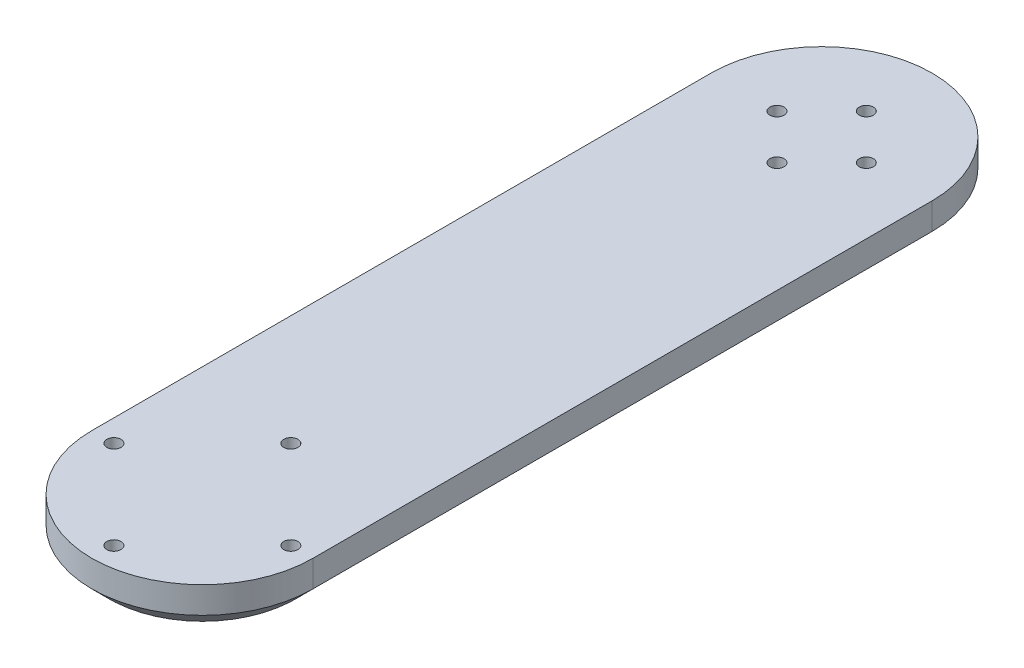
ISO-10303-21;
HEADER;
FILE_DESCRIPTION(('STEP AP214'),'2;1');
FILE_NAME('part.step','',(''),(''),'','','');
FILE_SCHEMA(('AUTOMOTIVE_DESIGN { 1 0 10303 214 1 1 1 1 }'));
ENDSEC;
DATA;
#1=APPLICATION_CONTEXT('core data for automotive mechanical design processes');
#2=APPLICATION_PROTOCOL_DEFINITION('international standard','automotive_design',2000,#1);
#3=PRODUCT_CONTEXT('',#1,'mechanical');
#4=PRODUCT('Part','Part','',(#3));
#5=PRODUCT_RELATED_PRODUCT_CATEGORY('part','',(#4));
#6=PRODUCT_DEFINITION_FORMATION('','',#4);
#7=PRODUCT_DEFINITION_CONTEXT('part definition',#1,'design');
#8=PRODUCT_DEFINITION('design','',#6,#7);
#9=PRODUCT_DEFINITION_SHAPE('','',#8);
#10=(LENGTH_UNIT() NAMED_UNIT(*) SI_UNIT(.MILLI.,.METRE.));
#11=(NAMED_UNIT(*) PLANE_ANGLE_UNIT() SI_UNIT($,.RADIAN.));
#12=(NAMED_UNIT(*) SI_UNIT($,.STERADIAN.) SOLID_ANGLE_UNIT());
#13=UNCERTAINTY_MEASURE_WITH_UNIT(LENGTH_MEASURE(1.E-05),#10,'distance_accuracy_value','');
#14=(GEOMETRIC_REPRESENTATION_CONTEXT(3) GLOBAL_UNCERTAINTY_ASSIGNED_CONTEXT((#13)) GLOBAL_UNIT_ASSIGNED_CONTEXT((#10,
#11,#12)) REPRESENTATION_CONTEXT('',''));
#15=CARTESIAN_POINT('',(0.,0.,0.));
#16=DIRECTION('',(0.,0.,1.));
#17=DIRECTION('',(1.,0.,0.));
#18=AXIS2_PLACEMENT_3D('',#15,#16,#17);
#19=CARTESIAN_POINT('',(0.,10.,0.));
#20=DIRECTION('',(0.,-1.,0.));
#21=DIRECTION('',(0.,0.,-1.));
#22=AXIS2_PLACEMENT_3D('',#19,#20,#21);
#23=CYLINDRICAL_SURFACE('',#22,25.);
#24=DIRECTION('',(0.,-1.,0.));
#25=VECTOR('',#24,1.);
#26=CARTESIAN_POINT('',(25.,10.,0.));
#27=LINE('',#26,#25);
#28=CARTESIAN_POINT('',(25.,10.,0.));
#29=VERTEX_POINT('',#28);
#30=CARTESIAN_POINT('',(25.,4.00000000000001,0.));
#31=VERTEX_POINT('',#30);
#32=EDGE_CURVE('E278',#29,#31,#27,.T.);
#33=ORIENTED_EDGE('',*,*,#32,.T.);
#34=CARTESIAN_POINT('',(0.,4.00000000000001,0.));
#35=DIRECTION('',(0.,1.,0.));
#36=DIRECTION('',(0.,0.,1.));
#37=AXIS2_PLACEMENT_3D('',#34,#35,#36);
#38=CIRCLE('',#37,25.);
#39=CARTESIAN_POINT('',(-25.,4.00000000000001,0.));
#40=VERTEX_POINT('',#39);
#41=EDGE_CURVE('E11',#31,#40,#38,.T.);
#42=ORIENTED_EDGE('',*,*,#41,.T.);
#43=DIRECTION('',(0.,-1.,0.));
#44=VECTOR('',#43,1.);
#45=CARTESIAN_POINT('',(-25.,10.,0.));
#46=LINE('',#45,#44);
#47=CARTESIAN_POINT('',(-25.,10.,0.));
#48=VERTEX_POINT('',#47);
#49=EDGE_CURVE('E125',#48,#40,#46,.T.);
#50=ORIENTED_EDGE('',*,*,#49,.F.);
#51=CARTESIAN_POINT('',(0.,10.,0.));
#52=DIRECTION('',(0.,1.,0.));
#53=DIRECTION('',(0.,0.,1.));
#54=AXIS2_PLACEMENT_3D('',#51,#52,#53);
#55=CIRCLE('',#54,25.);
#56=EDGE_CURVE('E133',#29,#48,#55,.T.);
#57=ORIENTED_EDGE('',*,*,#56,.F.);
#58=EDGE_LOOP('',(#33,#42,#50,#57));
#59=FACE_BOUND('',#58,.T.);
#60=ADVANCED_FACE('F47',(#59),#23,.T.);
#61=CARTESIAN_POINT('',(-25.,10.,0.));
#62=DIRECTION('',(1.,0.,0.));
#63=DIRECTION('',(0.,0.,-1.));
#64=AXIS2_PLACEMENT_3D('',#61,#62,#63);
#65=PLANE('',#64);
#66=ORIENTED_EDGE('',*,*,#49,.T.);
#67=DIRECTION('',(0.,0.,1.));
#68=VECTOR('',#67,1.);
#69=CARTESIAN_POINT('',(-25.,4.00000000000001,0.));
#70=LINE('',#69,#68);
#71=CARTESIAN_POINT('',(-25.,4.00000000000001,140.));
#72=VERTEX_POINT('',#71);
#73=EDGE_CURVE('E58',#40,#72,#70,.T.);
#74=ORIENTED_EDGE('',*,*,#73,.T.);
#75=DIRECTION('',(0.,-1.,0.));
#76=VECTOR('',#75,1.);
#77=CARTESIAN_POINT('',(-25.,10.,140.));
#78=LINE('',#77,#76);
#79=CARTESIAN_POINT('',(-25.,10.,140.));
#80=VERTEX_POINT('',#79);
#81=EDGE_CURVE('E128',#80,#72,#78,.T.);
#82=ORIENTED_EDGE('',*,*,#81,.F.);
#83=DIRECTION('',(0.,0.,1.));
#84=VECTOR('',#83,1.);
#85=CARTESIAN_POINT('',(-25.,10.,0.));
#86=LINE('',#85,#84);
#87=EDGE_CURVE('E122',#48,#80,#86,.T.);
#88=ORIENTED_EDGE('',*,*,#87,.F.);
#89=EDGE_LOOP('',(#66,#74,#82,#88));
#90=FACE_BOUND('',#89,.T.);
#91=ADVANCED_FACE('F124',(#90),#65,.F.);
#92=CARTESIAN_POINT('',(0.,10.,140.));
#93=DIRECTION('',(0.,-1.,0.));
#94=DIRECTION('',(0.,0.,-1.));
#95=AXIS2_PLACEMENT_3D('',#92,#93,#94);
#96=CYLINDRICAL_SURFACE('',#95,25.);
#97=ORIENTED_EDGE('',*,*,#81,.T.);
#98=CARTESIAN_POINT('',(0.,4.00000000000001,140.));
#99=DIRECTION('',(0.,1.,0.));
#100=DIRECTION('',(0.,0.,1.));
#101=AXIS2_PLACEMENT_3D('',#98,#99,#100);
#102=CIRCLE('',#101,25.);
#103=CARTESIAN_POINT('',(25.,4.00000000000001,140.));
#104=VERTEX_POINT('',#103);
#105=EDGE_CURVE('E143',#72,#104,#102,.T.);
#106=ORIENTED_EDGE('',*,*,#105,.T.);
#107=DIRECTION('',(0.,-1.,0.));
#108=VECTOR('',#107,1.);
#109=CARTESIAN_POINT('',(25.,10.,140.));
#110=LINE('',#109,#108);
#111=CARTESIAN_POINT('',(25.,10.,140.));
#112=VERTEX_POINT('',#111);
#113=EDGE_CURVE('E150',#112,#104,#110,.T.);
#114=ORIENTED_EDGE('',*,*,#113,.F.);
#115=CARTESIAN_POINT('',(0.,10.,140.));
#116=DIRECTION('',(0.,1.,0.));
#117=DIRECTION('',(0.,0.,1.));
#118=AXIS2_PLACEMENT_3D('',#115,#116,#117);
#119=CIRCLE('',#118,25.);
#120=EDGE_CURVE('E132',#80,#112,#119,.T.);
#121=ORIENTED_EDGE('',*,*,#120,.F.);
#122=EDGE_LOOP('',(#97,#106,#114,#121));
#123=FACE_BOUND('',#122,.T.);
#124=ADVANCED_FACE('F284',(#123),#96,.T.);
#125=CARTESIAN_POINT('',(25.,10.,0.));
#126=DIRECTION('',(-1.,0.,0.));
#127=DIRECTION('',(0.,0.,1.));
#128=AXIS2_PLACEMENT_3D('',#125,#126,#127);
#129=PLANE('',#128);
#130=ORIENTED_EDGE('',*,*,#113,.T.);
#131=DIRECTION('',(0.,0.,-1.));
#132=VECTOR('',#131,1.);
#133=CARTESIAN_POINT('',(25.,4.00000000000001,0.));
#134=LINE('',#133,#132);
#135=EDGE_CURVE('E72',#104,#31,#134,.T.);
#136=ORIENTED_EDGE('',*,*,#135,.T.);
#137=ORIENTED_EDGE('',*,*,#32,.F.);
#138=DIRECTION('',(0.,0.,-1.));
#139=VECTOR('',#138,1.);
#140=CARTESIAN_POINT('',(25.,10.,0.));
#141=LINE('',#140,#139);
#142=EDGE_CURVE('E138',#112,#29,#141,.T.);
#143=ORIENTED_EDGE('',*,*,#142,.F.);
#144=EDGE_LOOP('',(#130,#136,#137,#143));
#145=FACE_BOUND('',#144,.T.);
#146=ADVANCED_FACE('F282',(#145),#129,.F.);
#147=CARTESIAN_POINT('',(0.,10.,0.));
#148=DIRECTION('',(0.,1.,0.));
#149=DIRECTION('',(0.,0.,1.));
#150=AXIS2_PLACEMENT_3D('',#147,#148,#149);
#151=PLANE('',#150);
#152=CARTESIAN_POINT('',(0.,10.,120.));
#153=DIRECTION('',(0.,-1.,0.));
#154=DIRECTION('',(0.,0.,-1.));
#155=AXIS2_PLACEMENT_3D('',#152,#153,#154);
#156=CIRCLE('',#155,1.6);
#157=CARTESIAN_POINT('',(0.,10.,118.4));
#158=VERTEX_POINT('',#157);
#159=EDGE_CURVE('E272',#158,#158,#156,.T.);
#160=ORIENTED_EDGE('',*,*,#159,.T.);
#161=EDGE_LOOP('',(#160));
#162=FACE_BOUND('',#161,.T.);
#163=CARTESIAN_POINT('',(20.,10.,140.));
#164=DIRECTION('',(0.,-1.,0.));
#165=DIRECTION('',(0.,0.,-1.));
#166=AXIS2_PLACEMENT_3D('',#163,#164,#165);
#167=CIRCLE('',#166,1.59999999999999);
#168=CARTESIAN_POINT('',(20.,10.,138.4));
#169=VERTEX_POINT('',#168);
#170=EDGE_CURVE('E383',#169,#169,#167,.T.);
#171=ORIENTED_EDGE('',*,*,#170,.T.);
#172=EDGE_LOOP('',(#171));
#173=FACE_BOUND('',#172,.T.);
#174=CARTESIAN_POINT('',(0.,10.,160.));
#175=DIRECTION('',(0.,-1.,0.));
#176=DIRECTION('',(0.,0.,-1.));
#177=AXIS2_PLACEMENT_3D('',#174,#175,#176);
#178=CIRCLE('',#177,1.59999999999999);
#179=CARTESIAN_POINT('',(0.,10.,158.4));
#180=VERTEX_POINT('',#179);
#181=EDGE_CURVE('E238',#180,#180,#178,.T.);
#182=ORIENTED_EDGE('',*,*,#181,.T.);
#183=EDGE_LOOP('',(#182));
#184=FACE_BOUND('',#183,.T.);
#185=CARTESIAN_POINT('',(-20.,10.,140.));
#186=DIRECTION('',(0.,-1.,0.));
#187=DIRECTION('',(0.,0.,-1.));
#188=AXIS2_PLACEMENT_3D('',#185,#186,#187);
#189=CIRCLE('',#188,1.59999999999999);
#190=CARTESIAN_POINT('',(-20.,10.,138.4));
#191=VERTEX_POINT('',#190);
#192=EDGE_CURVE('E226',#191,#191,#189,.T.);
#193=ORIENTED_EDGE('',*,*,#192,.T.);
#194=EDGE_LOOP('',(#193));
#195=FACE_BOUND('',#194,.T.);
#196=CARTESIAN_POINT('',(10.0985931710275,10.,0.));
#197=DIRECTION('',(0.,-1.,0.));
#198=DIRECTION('',(0.,0.,-1.));
#199=AXIS2_PLACEMENT_3D('',#196,#197,#198);
#200=CIRCLE('',#199,1.60000000000001);
#201=CARTESIAN_POINT('',(10.0985931710275,10.,-1.60000000000007));
#202=VERTEX_POINT('',#201);
#203=EDGE_CURVE('E140',#202,#202,#200,.T.);
#204=ORIENTED_EDGE('',*,*,#203,.T.);
#205=EDGE_LOOP('',(#204));
#206=FACE_BOUND('',#205,.T.);
#207=CARTESIAN_POINT('',(0.,10.,10.0985931710274));
#208=DIRECTION('',(0.,-1.,0.));
#209=DIRECTION('',(0.,0.,-1.));
#210=AXIS2_PLACEMENT_3D('',#207,#208,#209);
#211=CIRCLE('',#210,1.60000000000001);
#212=CARTESIAN_POINT('',(0.,10.,8.49859317102738));
#213=VERTEX_POINT('',#212);
#214=EDGE_CURVE('E253',#213,#213,#211,.T.);
#215=ORIENTED_EDGE('',*,*,#214,.T.);
#216=EDGE_LOOP('',(#215));
#217=FACE_BOUND('',#216,.T.);
#218=CARTESIAN_POINT('',(0.,10.,-10.0985931710275));
#219=DIRECTION('',(0.,-1.,0.));
#220=DIRECTION('',(0.,0.,-1.));
#221=AXIS2_PLACEMENT_3D('',#218,#219,#220);
#222=CIRCLE('',#221,1.60000000000001);
#223=CARTESIAN_POINT('',(0.,10.,-11.6985931710275));
#224=VERTEX_POINT('',#223);
#225=EDGE_CURVE('E261',#224,#224,#222,.T.);
#226=ORIENTED_EDGE('',*,*,#225,.T.);
#227=EDGE_LOOP('',(#226));
#228=FACE_BOUND('',#227,.T.);
#229=CARTESIAN_POINT('',(-10.0985931710274,10.,0.));
#230=DIRECTION('',(0.,-1.,0.));
#231=DIRECTION('',(0.,0.,-1.));
#232=AXIS2_PLACEMENT_3D('',#229,#230,#231);
#233=CIRCLE('',#232,1.60000000000001);
#234=CARTESIAN_POINT('',(-10.0985931710274,10.,-1.60000000000007));
#235=VERTEX_POINT('',#234);
#236=EDGE_CURVE('E269',#235,#235,#233,.T.);
#237=ORIENTED_EDGE('',*,*,#236,.T.);
#238=EDGE_LOOP('',(#237));
#239=FACE_BOUND('',#238,.T.);
#240=ORIENTED_EDGE('',*,*,#56,.T.);
#241=ORIENTED_EDGE('',*,*,#87,.T.);
#242=ORIENTED_EDGE('',*,*,#120,.T.);
#243=ORIENTED_EDGE('',*,*,#142,.T.);
#244=EDGE_LOOP('',(#240,#241,#242,#243));
#245=FACE_BOUND('',#244,.T.);
#246=ADVANCED_FACE('F136',(#162,#173,#184,#195,#206,#217,#228,#239,#245),#151,.T.);
#247=CARTESIAN_POINT('',(0.,0.,0.));
#248=DIRECTION('',(0.,1.,0.));
#249=DIRECTION('',(0.,0.,1.));
#250=AXIS2_PLACEMENT_3D('',#247,#248,#249);
#251=PLANE('',#250);
#252=CARTESIAN_POINT('',(0.,0.,120.));
#253=DIRECTION('',(0.,-1.,0.));
#254=DIRECTION('',(0.,0.,-1.));
#255=AXIS2_PLACEMENT_3D('',#252,#253,#254);
#256=CIRCLE('',#255,1.6);
#257=CARTESIAN_POINT('',(0.,0.,118.4));
#258=VERTEX_POINT('',#257);
#259=EDGE_CURVE('E382',#258,#258,#256,.T.);
#260=ORIENTED_EDGE('',*,*,#259,.F.);
#261=EDGE_LOOP('',(#260));
#262=FACE_BOUND('',#261,.T.);
#263=CARTESIAN_POINT('',(20.,0.,140.));
#264=DIRECTION('',(0.,-1.,0.));
#265=DIRECTION('',(0.,0.,-1.));
#266=AXIS2_PLACEMENT_3D('',#263,#264,#265);
#267=CIRCLE('',#266,1.59999999999999);
#268=CARTESIAN_POINT('',(20.961,0.,141.27924938929));
#269=VERTEX_POINT('',#268);
#270=CARTESIAN_POINT('',(21.,0.,138.75100040032));
#271=VERTEX_POINT('',#270);
#272=EDGE_CURVE('E380',#269,#271,#267,.T.);
#273=ORIENTED_EDGE('',*,*,#272,.F.);
#274=CARTESIAN_POINT('',(0.,0.,140.));
#275=DIRECTION('',(0.,1.,0.));
#276=DIRECTION('',(0.,0.,1.));
#277=AXIS2_PLACEMENT_3D('',#274,#275,#276);
#278=CIRCLE('',#277,21.);
#279=CARTESIAN_POINT('',(1.2792493892904,0.,160.961));
#280=VERTEX_POINT('',#279);
#281=EDGE_CURVE('E197',#269,#280,#278,.F.);
#282=ORIENTED_EDGE('',*,*,#281,.T.);
#283=CARTESIAN_POINT('',(0.,0.,160.));
#284=DIRECTION('',(0.,-1.,0.));
#285=DIRECTION('',(0.,0.,-1.));
#286=AXIS2_PLACEMENT_3D('',#283,#284,#285);
#287=CIRCLE('',#286,1.59999999999999);
#288=CARTESIAN_POINT('',(-1.27924938929037,0.,160.961));
#289=VERTEX_POINT('',#288);
#290=EDGE_CURVE('E390',#289,#280,#287,.T.);
#291=ORIENTED_EDGE('',*,*,#290,.F.);
#292=CARTESIAN_POINT('',(0.,0.,140.));
#293=DIRECTION('',(0.,1.,0.));
#294=DIRECTION('',(0.,0.,1.));
#295=AXIS2_PLACEMENT_3D('',#292,#293,#294);
#296=CIRCLE('',#295,21.);
#297=CARTESIAN_POINT('',(-20.961,0.,141.27924938929));
#298=VERTEX_POINT('',#297);
#299=EDGE_CURVE('E364',#289,#298,#296,.F.);
#300=ORIENTED_EDGE('',*,*,#299,.T.);
#301=CARTESIAN_POINT('',(-20.,0.,140.));
#302=DIRECTION('',(0.,-1.,0.));
#303=DIRECTION('',(0.,0.,-1.));
#304=AXIS2_PLACEMENT_3D('',#301,#302,#303);
#305=CIRCLE('',#304,1.59999999999999);
#306=CARTESIAN_POINT('',(-21.,0.,138.75100040032));
#307=VERTEX_POINT('',#306);
#308=EDGE_CURVE('E232',#307,#298,#305,.T.);
#309=ORIENTED_EDGE('',*,*,#308,.F.);
#310=DIRECTION('',(0.,0.,-1.));
#311=VECTOR('',#310,1.);
#312=CARTESIAN_POINT('',(-21.,0.,0.));
#313=LINE('',#312,#311);
#314=CARTESIAN_POINT('',(-21.,0.,0.));
#315=VERTEX_POINT('',#314);
#316=EDGE_CURVE('E371',#307,#315,#313,.T.);
#317=ORIENTED_EDGE('',*,*,#316,.T.);
#318=CARTESIAN_POINT('',(0.,0.,0.));
#319=DIRECTION('',(0.,1.,0.));
#320=DIRECTION('',(0.,0.,1.));
#321=AXIS2_PLACEMENT_3D('',#318,#319,#320);
#322=CIRCLE('',#321,21.);
#323=CARTESIAN_POINT('',(21.,0.,0.));
#324=VERTEX_POINT('',#323);
#325=EDGE_CURVE('E165',#315,#324,#322,.F.);
#326=ORIENTED_EDGE('',*,*,#325,.T.);
#327=DIRECTION('',(0.,0.,1.));
#328=VECTOR('',#327,1.);
#329=CARTESIAN_POINT('',(21.,0.,0.));
#330=LINE('',#329,#328);
#331=EDGE_CURVE('E368',#324,#271,#330,.T.);
#332=ORIENTED_EDGE('',*,*,#331,.T.);
#333=EDGE_LOOP('',(#273,#282,#291,#300,#309,#317,#326,#332));
#334=FACE_BOUND('',#333,.T.);
#335=CARTESIAN_POINT('',(10.0985931710275,0.,0.));
#336=DIRECTION('',(0.,-1.,0.));
#337=DIRECTION('',(0.,0.,-1.));
#338=AXIS2_PLACEMENT_3D('',#335,#336,#337);
#339=CIRCLE('',#338,1.60000000000001);
#340=CARTESIAN_POINT('',(10.0985931710275,0.,-1.60000000000007));
#341=VERTEX_POINT('',#340);
#342=EDGE_CURVE('E245',#341,#341,#339,.T.);
#343=ORIENTED_EDGE('',*,*,#342,.F.);
#344=EDGE_LOOP('',(#343));
#345=FACE_BOUND('',#344,.T.);
#346=CARTESIAN_POINT('',(0.,0.,10.0985931710274));
#347=DIRECTION('',(0.,-1.,0.));
#348=DIRECTION('',(0.,0.,-1.));
#349=AXIS2_PLACEMENT_3D('',#346,#347,#348);
#350=CIRCLE('',#349,1.60000000000001);
#351=CARTESIAN_POINT('',(0.,0.,8.49859317102738));
#352=VERTEX_POINT('',#351);
#353=EDGE_CURVE('E249',#352,#352,#350,.T.);
#354=ORIENTED_EDGE('',*,*,#353,.F.);
#355=EDGE_LOOP('',(#354));
#356=FACE_BOUND('',#355,.T.);
#357=CARTESIAN_POINT('',(0.,0.,-10.0985931710275));
#358=DIRECTION('',(0.,-1.,0.));
#359=DIRECTION('',(0.,0.,-1.));
#360=AXIS2_PLACEMENT_3D('',#357,#358,#359);
#361=CIRCLE('',#360,1.60000000000001);
#362=CARTESIAN_POINT('',(0.,0.,-11.6985931710275));
#363=VERTEX_POINT('',#362);
#364=EDGE_CURVE('E257',#363,#363,#361,.T.);
#365=ORIENTED_EDGE('',*,*,#364,.F.);
#366=EDGE_LOOP('',(#365));
#367=FACE_BOUND('',#366,.T.);
#368=CARTESIAN_POINT('',(-10.0985931710274,0.,0.));
#369=DIRECTION('',(0.,-1.,0.));
#370=DIRECTION('',(0.,0.,-1.));
#371=AXIS2_PLACEMENT_3D('',#368,#369,#370);
#372=CIRCLE('',#371,1.60000000000001);
#373=CARTESIAN_POINT('',(-10.0985931710274,0.,-1.60000000000007));
#374=VERTEX_POINT('',#373);
#375=EDGE_CURVE('E265',#374,#374,#372,.T.);
#376=ORIENTED_EDGE('',*,*,#375,.F.);
#377=EDGE_LOOP('',(#376));
#378=FACE_BOUND('',#377,.T.);
#379=ADVANCED_FACE('F312',(#262,#334,#345,#356,#367,#378),#251,.F.);
#380=CARTESIAN_POINT('',(-10.0985931710274,10.,0.));
#381=DIRECTION('',(0.,-1.,0.));
#382=DIRECTION('',(0.,0.,-1.));
#383=AXIS2_PLACEMENT_3D('',#380,#381,#382);
#384=CYLINDRICAL_SURFACE('',#383,1.60000000000001);
#385=ORIENTED_EDGE('',*,*,#236,.F.);
#386=EDGE_LOOP('',(#385));
#387=FACE_BOUND('',#386,.T.);
#388=ORIENTED_EDGE('',*,*,#375,.T.);
#389=EDGE_LOOP('',(#388));
#390=FACE_BOUND('',#389,.T.);
#391=ADVANCED_FACE('F315',(#387,#390),#384,.F.);
#392=CARTESIAN_POINT('',(0.,10.,-10.0985931710275));
#393=DIRECTION('',(0.,-1.,0.));
#394=DIRECTION('',(0.,0.,-1.));
#395=AXIS2_PLACEMENT_3D('',#392,#393,#394);
#396=CYLINDRICAL_SURFACE('',#395,1.60000000000001);
#397=ORIENTED_EDGE('',*,*,#225,.F.);
#398=EDGE_LOOP('',(#397));
#399=FACE_BOUND('',#398,.T.);
#400=ORIENTED_EDGE('',*,*,#364,.T.);
#401=EDGE_LOOP('',(#400));
#402=FACE_BOUND('',#401,.T.);
#403=ADVANCED_FACE('F322',(#399,#402),#396,.F.);
#404=CARTESIAN_POINT('',(0.,10.,10.0985931710274));
#405=DIRECTION('',(0.,-1.,0.));
#406=DIRECTION('',(0.,0.,-1.));
#407=AXIS2_PLACEMENT_3D('',#404,#405,#406);
#408=CYLINDRICAL_SURFACE('',#407,1.60000000000001);
#409=ORIENTED_EDGE('',*,*,#214,.F.);
#410=EDGE_LOOP('',(#409));
#411=FACE_BOUND('',#410,.T.);
#412=ORIENTED_EDGE('',*,*,#353,.T.);
#413=EDGE_LOOP('',(#412));
#414=FACE_BOUND('',#413,.T.);
#415=ADVANCED_FACE('F326',(#411,#414),#408,.F.);
#416=CARTESIAN_POINT('',(10.0985931710275,10.,0.));
#417=DIRECTION('',(0.,-1.,0.));
#418=DIRECTION('',(0.,0.,-1.));
#419=AXIS2_PLACEMENT_3D('',#416,#417,#418);
#420=CYLINDRICAL_SURFACE('',#419,1.60000000000001);
#421=ORIENTED_EDGE('',*,*,#203,.F.);
#422=EDGE_LOOP('',(#421));
#423=FACE_BOUND('',#422,.T.);
#424=ORIENTED_EDGE('',*,*,#342,.T.);
#425=EDGE_LOOP('',(#424));
#426=FACE_BOUND('',#425,.T.);
#427=ADVANCED_FACE('F329',(#423,#426),#420,.F.);
#428=CARTESIAN_POINT('',(-20.,10.,140.));
#429=DIRECTION('',(0.,-1.,0.));
#430=DIRECTION('',(0.,0.,-1.));
#431=AXIS2_PLACEMENT_3D('',#428,#429,#430);
#432=CYLINDRICAL_SURFACE('',#431,1.59999999999999);
#433=ORIENTED_EDGE('',*,*,#192,.F.);
#434=EDGE_LOOP('',(#433));
#435=FACE_BOUND('',#434,.T.);
#436=ORIENTED_EDGE('',*,*,#308,.T.);
#437=CARTESIAN_POINT('',(-20.961,0.,141.27924938929));
#438=CARTESIAN_POINT('',(-21.0266927508743,0.0625761671923724,141.22990480349));
#439=CARTESIAN_POINT('',(-21.0903995474147,0.122957620692161,141.174107593131));
#440=CARTESIAN_POINT('',(-21.2114098926424,0.237221240759362,141.048880073953));
#441=CARTESIAN_POINT('',(-21.2686476069787,0.29103696397094,140.979326519933));
#442=CARTESIAN_POINT('',(-21.3608973825036,0.377496044244204,140.84439307812));
#443=CARTESIAN_POINT('',(-21.3979896323169,0.412158840896568,140.781758368361));
#444=CARTESIAN_POINT('',(-21.4642366224618,0.473947305640577,140.649206696684));
#445=CARTESIAN_POINT('',(-21.4934178503671,0.501098131650166,140.579315147105));
#446=CARTESIAN_POINT('',(-21.5386456584481,0.543124357247478,140.443771790856));
#447=CARTESIAN_POINT('',(-21.5559653001771,0.559191962855602,140.378915577703));
#448=CARTESIAN_POINT('',(-21.5823891205658,0.583691038078066,140.246169699359));
#449=CARTESIAN_POINT('',(-21.5915067345281,0.592134995664881,140.17828518686));
#450=CARTESIAN_POINT('',(-21.5974791481647,0.597665750832051,140.09165227218));
#451=CARTESIAN_POINT('',(-21.598424366787,0.598541028635356,140.073334598142));
#452=CARTESIAN_POINT('',(-21.5996839388714,0.599707367007014,140.03668026352));
#453=CARTESIAN_POINT('',(-21.5999990221802,0.599999103455214,140.018343649542));
#454=CARTESIAN_POINT('',(-21.6,0.599999999999969,140.));
#455=B_SPLINE_CURVE_WITH_KNOTS('',3,(#437,#438,#439,#440,#441,#442,#443,#444,#445,#446,#447,
#448,#449,#450,#451,#452,#453,#454),.UNSPECIFIED.,.F.,.F.,(4,2,2,2,2,2,2,2,4),(0.,
0.310380522223147,0.623679221150237,0.86463004182366,1.10476386101359,1.31097859885191,
1.51685492902013,1.57193065486272,1.62694255287585),.UNSPECIFIED.);
#456=CARTESIAN_POINT('',(-21.6,0.599999999999964,140.));
#457=VERTEX_POINT('',#456);
#458=EDGE_CURVE('E201',#298,#457,#455,.T.);
#459=ORIENTED_EDGE('',*,*,#458,.T.);
#460=CARTESIAN_POINT('',(-20.,-1.00000000000003,140.));
#461=DIRECTION('',(0.707106781186549,0.707106781186547,0.));
#462=DIRECTION('',(0.707106781186547,-0.707106781186549,0.));
#463=AXIS2_PLACEMENT_3D('',#460,#461,#462);
#464=ELLIPSE('',#463,2.26274169979694,1.59999999999999);
#465=EDGE_CURVE('E196',#457,#307,#464,.F.);
#466=ORIENTED_EDGE('',*,*,#465,.T.);
#467=EDGE_LOOP('',(#436,#459,#466));
#468=FACE_BOUND('',#467,.T.);
#469=ADVANCED_FACE('F183',(#435,#468),#432,.F.);
#470=CARTESIAN_POINT('',(0.,10.,160.));
#471=DIRECTION('',(0.,-1.,0.));
#472=DIRECTION('',(0.,0.,-1.));
#473=AXIS2_PLACEMENT_3D('',#470,#471,#472);
#474=CYLINDRICAL_SURFACE('',#473,1.59999999999999);
#475=ORIENTED_EDGE('',*,*,#181,.F.);
#476=EDGE_LOOP('',(#475));
#477=FACE_BOUND('',#476,.T.);
#478=ORIENTED_EDGE('',*,*,#290,.T.);
#479=CARTESIAN_POINT('',(1.2792493892904,0.,160.961));
#480=CARTESIAN_POINT('',(1.22989478676789,0.0625857759260987,161.026702835617));
#481=CARTESIAN_POINT('',(1.17408967534836,0.12297570451546,161.090418624167));
#482=CARTESIAN_POINT('',(1.04886097710246,0.237236912469309,161.211426562488));
#483=CARTESIAN_POINT('',(0.979318029637592,0.29104383875503,161.268654948507));
#484=CARTESIAN_POINT('',(0.844402238654495,0.377489071332947,161.36088993773));
#485=CARTESIAN_POINT('',(0.781775794365643,0.412146294166835,161.397976187987));
#486=CARTESIAN_POINT('',(0.649240266506274,0.473936061576356,161.464224559521));
#487=CARTESIAN_POINT('',(0.579353657779874,0.501090928730108,161.493410183048));
#488=CARTESIAN_POINT('',(0.432695247345442,0.546553936428103,161.542336419804));
#489=CARTESIAN_POINT('',(0.355860968782323,0.564769842446676,161.561978541028));
#490=CARTESIAN_POINT('',(0.198350565575469,0.59043134112886,161.589663824256));
#491=CARTESIAN_POINT('',(0.117676330933351,0.597882176810711,161.59771263266));
#492=CARTESIAN_POINT('',(-0.032347613349704,0.601083712852686,161.601170518029));
#493=CARTESIAN_POINT('',(-0.101633953552921,0.598381547481165,161.598250982111));
#494=CARTESIAN_POINT('',(-0.23843702752716,0.584836162881755,161.583627665651));
#495=CARTESIAN_POINT('',(-0.305954091040191,0.57399447195529,161.571925534156));
#496=CARTESIAN_POINT('',(-0.435453972995801,0.545307474533,161.541001964885));
#497=CARTESIAN_POINT('',(-0.497541068334537,0.527677100014304,161.522011338524));
#498=CARTESIAN_POINT('',(-0.61718043803611,0.486335466443341,161.477554624832));
#499=CARTESIAN_POINT('',(-0.674730746557891,0.462621590069464,161.452085750389));
#500=CARTESIAN_POINT('',(-0.806678808872184,0.399534392349422,161.384468106407));
#501=CARTESIAN_POINT('',(-0.878570221960109,0.35769576898188,161.339727145773));
#502=CARTESIAN_POINT('',(-1.01149807762278,0.26640797149216,161.242450600292));
#503=CARTESIAN_POINT('',(-1.0725119903894,0.216943388251416,161.189899241559));
#504=CARTESIAN_POINT('',(-1.15603803901889,0.138470084617907,161.106855583229));
#505=CARTESIAN_POINT('',(-1.18261091489462,0.111517738740975,161.078385572856));
#506=CARTESIAN_POINT('',(-1.23295590978154,0.0565441072013595,161.020432425132));
#507=CARTESIAN_POINT('',(-1.25674215723445,0.0285292606133538,160.990955473193));
#508=CARTESIAN_POINT('',(-1.27924938929136,5.31298523514658E-13,160.961000000001));
#509=B_SPLINE_CURVE_WITH_KNOTS('',3,(#479,#480,#481,#482,#483,#484,#485,#486,#487,#488,#489,
#490,#491,#492,#493,#494,#495,#496,#497,#498,#499,#500,#501,#502,#503,#504,#505,#506,#507,#508),
.UNSPECIFIED.,.F.,.F.,(4,2,2,2,2,2,2,2,2,2,2,2,2,2,4),(0.,0.310426524405879,0.623679253747494,
0.864583914259509,1.10476387011129,1.34737251984708,1.58986296962501,1.79700743036873,
2.00411300677925,2.20513904281961,2.40625171231264,2.68806556029077,2.97045649463396,
3.11245251755536,3.25369422167458),.UNSPECIFIED.);
#510=EDGE_CURVE('E188',#280,#289,#509,.T.);
#511=ORIENTED_EDGE('',*,*,#510,.T.);
#512=EDGE_LOOP('',(#478,#511));
#513=FACE_BOUND('',#512,.T.);
#514=ADVANCED_FACE('F178',(#477,#513),#474,.F.);
#515=CARTESIAN_POINT('',(20.,10.,140.));
#516=DIRECTION('',(0.,-1.,0.));
#517=DIRECTION('',(0.,0.,-1.));
#518=AXIS2_PLACEMENT_3D('',#515,#516,#517);
#519=CYLINDRICAL_SURFACE('',#518,1.59999999999999);
#520=ORIENTED_EDGE('',*,*,#170,.F.);
#521=EDGE_LOOP('',(#520));
#522=FACE_BOUND('',#521,.T.);
#523=CARTESIAN_POINT('',(20.,-1.00000000000003,140.));
#524=DIRECTION('',(-0.707106781186549,0.707106781186547,0.));
#525=DIRECTION('',(-0.707106781186547,-0.707106781186549,0.));
#526=AXIS2_PLACEMENT_3D('',#523,#524,#525);
#527=ELLIPSE('',#526,2.26274169979694,1.59999999999999);
#528=CARTESIAN_POINT('',(21.6,0.599999999999968,140.));
#529=VERTEX_POINT('',#528);
#530=EDGE_CURVE('E148',#271,#529,#527,.F.);
#531=ORIENTED_EDGE('',*,*,#530,.T.);
#532=CARTESIAN_POINT('',(21.6,0.599999999999963,140.));
#533=CARTESIAN_POINT('',(21.6000085850438,0.600007567140051,140.036561732096));
#534=CARTESIAN_POINT('',(21.5987470692224,0.598839870628556,140.073117386057));
#535=CARTESIAN_POINT('',(21.593749762624,0.594212192657868,140.14588943794));
#536=CARTESIAN_POINT('',(21.5900156198041,0.590753737943366,140.182106045537));
#537=CARTESIAN_POINT('',(21.5801777109198,0.581638672575275,140.253639651102));
#538=CARTESIAN_POINT('',(21.5740928351412,0.575999584955435,140.28896148722));
#539=CARTESIAN_POINT('',(21.5596736887837,0.562629529955069,140.358732401912));
#540=CARTESIAN_POINT('',(21.551339156672,0.554898319355422,140.393181378503));
#541=CARTESIAN_POINT('',(21.5232135283417,0.528791070103936,140.494701194655));
#542=CARTESIAN_POINT('',(21.5002661954705,0.507469801975775,140.560184002048));
#543=CARTESIAN_POINT('',(21.4472837614813,0.458144316144545,140.685588593234));
#544=CARTESIAN_POINT('',(21.4172323132507,0.430124683292439,140.745497100312));
#545=CARTESIAN_POINT('',(21.3393922510545,0.357374512557307,140.879800148566));
#546=CARTESIAN_POINT('',(21.2891353697871,0.310279365573173,140.951485545027));
#547=CARTESIAN_POINT('',(21.1810979431088,0.208641893067631,141.082708991378));
#548=CARTESIAN_POINT('',(21.1233131244006,0.154095336829614,141.142240092127));
#549=CARTESIAN_POINT('',(21.0296791860685,0.0653314659377159,141.225450527579));
#550=CARTESIAN_POINT('',(20.9956361218951,0.0329884212083348,141.253222420313));
#551=CARTESIAN_POINT('',(20.9610000000001,0.,141.27924938929));
#552=B_SPLINE_CURVE_WITH_KNOTS('',3,(#532,#533,#534,#535,#536,#537,#538,#539,#540,#541,#542,
#543,#544,#545,#546,#547,#548,#549,#550,#551),.UNSPECIFIED.,.F.,.F.,(4,2,2,2,2,2,2,2,2,4),(0.,
0.109634873821565,0.219196751609243,0.327895923114964,0.436607736842741,0.653310346252425,
0.870516543887116,1.16711603666411,1.46388463632522,1.62734761452179),.UNSPECIFIED.);
#553=EDGE_CURVE('E156',#529,#269,#552,.T.);
#554=ORIENTED_EDGE('',*,*,#553,.T.);
#555=ORIENTED_EDGE('',*,*,#272,.T.);
#556=EDGE_LOOP('',(#531,#554,#555));
#557=FACE_BOUND('',#556,.T.);
#558=ADVANCED_FACE('F172',(#522,#557),#519,.F.);
#559=CARTESIAN_POINT('',(0.,10.,120.));
#560=DIRECTION('',(0.,-1.,0.));
#561=DIRECTION('',(0.,0.,-1.));
#562=AXIS2_PLACEMENT_3D('',#559,#560,#561);
#563=CYLINDRICAL_SURFACE('',#562,1.6);
#564=ORIENTED_EDGE('',*,*,#159,.F.);
#565=EDGE_LOOP('',(#564));
#566=FACE_BOUND('',#565,.T.);
#567=ORIENTED_EDGE('',*,*,#259,.T.);
#568=EDGE_LOOP('',(#567));
#569=FACE_BOUND('',#568,.T.);
#570=ADVANCED_FACE('F177',(#566,#569),#563,.F.);
#571=CARTESIAN_POINT('',(0.,4.00000000000001,0.));
#572=DIRECTION('',(0.,1.,0.));
#573=DIRECTION('',(0.,0.,1.));
#574=AXIS2_PLACEMENT_3D('',#571,#572,#573);
#575=CONICAL_SURFACE('',#574,25.,0.785398163397447);
#576=DIRECTION('',(0.707106781186547,0.707106781186549,0.));
#577=VECTOR('',#576,1.);
#578=CARTESIAN_POINT('',(21.,0.,0.));
#579=LINE('',#578,#577);
#580=EDGE_CURVE('E218',#324,#31,#579,.T.);
#581=ORIENTED_EDGE('',*,*,#580,.F.);
#582=ORIENTED_EDGE('',*,*,#325,.F.);
#583=DIRECTION('',(0.707106781186547,-0.707106781186549,0.));
#584=VECTOR('',#583,1.);
#585=CARTESIAN_POINT('',(-25.,4.00000000000001,0.));
#586=LINE('',#585,#584);
#587=EDGE_CURVE('E52',#40,#315,#586,.T.);
#588=ORIENTED_EDGE('',*,*,#587,.F.);
#589=ORIENTED_EDGE('',*,*,#41,.F.);
#590=EDGE_LOOP('',(#581,#582,#588,#589));
#591=FACE_BOUND('',#590,.T.);
#592=ADVANCED_FACE('F50',(#591),#575,.T.);
#593=CARTESIAN_POINT('',(-25.,4.00000000000001,0.));
#594=DIRECTION('',(0.707106781186549,0.707106781186547,0.));
#595=DIRECTION('',(0.,0.,1.));
#596=AXIS2_PLACEMENT_3D('',#593,#594,#595);
#597=PLANE('',#596);
#598=ORIENTED_EDGE('',*,*,#316,.F.);
#599=ORIENTED_EDGE('',*,*,#465,.F.);
#600=DIRECTION('',(-0.707106781186547,0.707106781186549,0.));
#601=VECTOR('',#600,1.);
#602=CARTESIAN_POINT('',(-12.5,-8.50000000000001,140.));
#603=LINE('',#602,#601);
#604=EDGE_CURVE('E215',#72,#457,#603,.F.);
#605=ORIENTED_EDGE('',*,*,#604,.F.);
#606=ORIENTED_EDGE('',*,*,#73,.F.);
#607=ORIENTED_EDGE('',*,*,#587,.T.);
#608=EDGE_LOOP('',(#598,#599,#605,#606,#607));
#609=FACE_BOUND('',#608,.T.);
#610=ADVANCED_FACE('F295',(#609),#597,.F.);
#611=CARTESIAN_POINT('',(25.,4.00000000000001,0.));
#612=DIRECTION('',(-0.707106781186549,0.707106781186547,0.));
#613=DIRECTION('',(0.,0.,-1.));
#614=AXIS2_PLACEMENT_3D('',#611,#612,#613);
#615=PLANE('',#614);
#616=ORIENTED_EDGE('',*,*,#580,.T.);
#617=ORIENTED_EDGE('',*,*,#135,.F.);
#618=DIRECTION('',(0.707106781186547,0.707106781186549,0.));
#619=VECTOR('',#618,1.);
#620=CARTESIAN_POINT('',(12.5000000000001,-8.5,140.));
#621=LINE('',#620,#619);
#622=EDGE_CURVE('E212',#529,#104,#621,.T.);
#623=ORIENTED_EDGE('',*,*,#622,.F.);
#624=ORIENTED_EDGE('',*,*,#530,.F.);
#625=ORIENTED_EDGE('',*,*,#331,.F.);
#626=EDGE_LOOP('',(#616,#617,#623,#624,#625));
#627=FACE_BOUND('',#626,.T.);
#628=ADVANCED_FACE('F293',(#627),#615,.F.);
#629=CARTESIAN_POINT('',(0.,4.00000000000001,140.));
#630=DIRECTION('',(0.,1.,0.));
#631=DIRECTION('',(0.,0.,1.));
#632=AXIS2_PLACEMENT_3D('',#629,#630,#631);
#633=CONICAL_SURFACE('',#632,25.,0.785398163397447);
#634=ORIENTED_EDGE('',*,*,#510,.F.);
#635=ORIENTED_EDGE('',*,*,#281,.F.);
#636=ORIENTED_EDGE('',*,*,#553,.F.);
#637=ORIENTED_EDGE('',*,*,#622,.T.);
#638=ORIENTED_EDGE('',*,*,#105,.F.);
#639=ORIENTED_EDGE('',*,*,#604,.T.);
#640=ORIENTED_EDGE('',*,*,#458,.F.);
#641=ORIENTED_EDGE('',*,*,#299,.F.);
#642=EDGE_LOOP('',(#634,#635,#636,#637,#638,#639,#640,#641));
#643=FACE_BOUND('',#642,.T.);
#644=ADVANCED_FACE('F168',(#643),#633,.T.);
#645=CLOSED_SHELL('',(#60,#91,#124,#146,#246,#379,#391,#403,#415,#427,#469,#514,#558,#570,#592,
#610,#628,#644));
#646=MANIFOLD_SOLID_BREP('B2',#645);
#647=ADVANCED_BREP_SHAPE_REPRESENTATION('',(#18,#646),#14);
#648=SHAPE_DEFINITION_REPRESENTATION(#9,#647);
ENDSEC;
END-ISO-10303-21;
